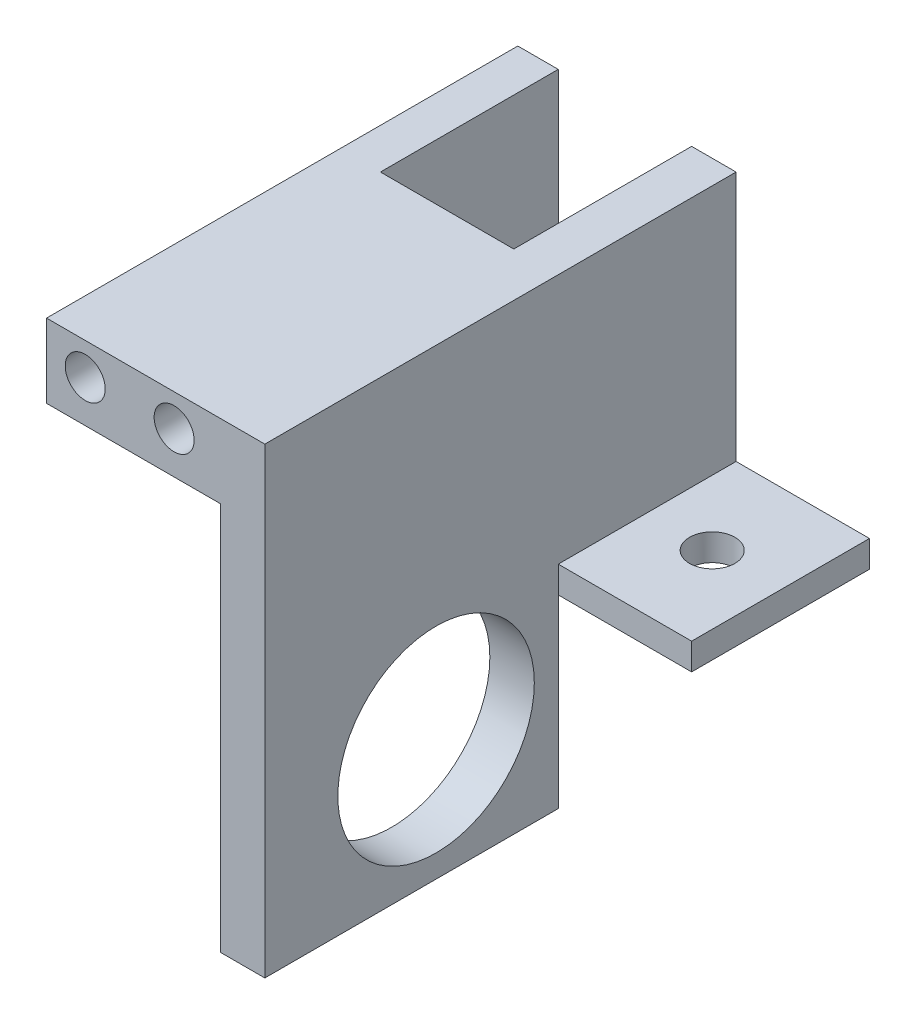
ISO-10303-21;
HEADER;
FILE_DESCRIPTION(('STEP AP214'),'2;1');
FILE_NAME('part.step','',(''),(''),'','','');
FILE_SCHEMA(('AUTOMOTIVE_DESIGN { 1 0 10303 214 1 1 1 1 }'));
ENDSEC;
DATA;
#1=APPLICATION_CONTEXT('core data for automotive mechanical design processes');
#2=APPLICATION_PROTOCOL_DEFINITION('international standard','automotive_design',2000,#1);
#3=PRODUCT_CONTEXT('',#1,'mechanical');
#4=PRODUCT('Part','Part','',(#3));
#5=PRODUCT_RELATED_PRODUCT_CATEGORY('part','',(#4));
#6=PRODUCT_DEFINITION_FORMATION('','',#4);
#7=PRODUCT_DEFINITION_CONTEXT('part definition',#1,'design');
#8=PRODUCT_DEFINITION('design','',#6,#7);
#9=PRODUCT_DEFINITION_SHAPE('','',#8);
#10=(LENGTH_UNIT() NAMED_UNIT(*) SI_UNIT(.MILLI.,.METRE.));
#11=(NAMED_UNIT(*) PLANE_ANGLE_UNIT() SI_UNIT($,.RADIAN.));
#12=(NAMED_UNIT(*) SI_UNIT($,.STERADIAN.) SOLID_ANGLE_UNIT());
#13=UNCERTAINTY_MEASURE_WITH_UNIT(LENGTH_MEASURE(1.E-05),#10,'distance_accuracy_value','');
#14=(GEOMETRIC_REPRESENTATION_CONTEXT(3) GLOBAL_UNCERTAINTY_ASSIGNED_CONTEXT((#13)) GLOBAL_UNIT_ASSIGNED_CONTEXT((#10,
#11,#12)) REPRESENTATION_CONTEXT('',''));
#15=CARTESIAN_POINT('',(0.,0.,0.));
#16=DIRECTION('',(0.,0.,1.));
#17=DIRECTION('',(1.,0.,0.));
#18=AXIS2_PLACEMENT_3D('',#15,#16,#17);
#19=CARTESIAN_POINT('',(0.,-27.8855947664452,0.));
#20=DIRECTION('',(0.,1.,0.));
#21=DIRECTION('',(0.,0.,1.));
#22=AXIS2_PLACEMENT_3D('',#19,#20,#21);
#23=PLANE('',#22);
#24=DIRECTION('',(-1.,0.,0.));
#25=VECTOR('',#24,1.);
#26=CARTESIAN_POINT('',(10.3166666666667,-27.8855947664452,-3.));
#27=LINE('',#26,#25);
#28=CARTESIAN_POINT('',(15.3166666666667,-27.8855947664452,-3.));
#29=VERTEX_POINT('',#28);
#30=CARTESIAN_POINT('',(10.3166666666667,-27.8855947664452,-3.));
#31=VERTEX_POINT('',#30);
#32=EDGE_CURVE('E271',#29,#31,#27,.T.);
#33=ORIENTED_EDGE('',*,*,#32,.T.);
#34=DIRECTION('',(1.,0.,0.));
#35=VECTOR('',#34,1.);
#36=CARTESIAN_POINT('',(-4.68333333333333,-27.8855947664452,-3.));
#37=LINE('',#36,#35);
#38=CARTESIAN_POINT('',(-9.23333333333332,-27.8855947664452,-3.));
#39=VERTEX_POINT('',#38);
#40=EDGE_CURVE('E252',#39,#31,#37,.T.);
#41=ORIENTED_EDGE('',*,*,#40,.F.);
#42=DIRECTION('',(0.,0.,-1.));
#43=VECTOR('',#42,1.);
#44=CARTESIAN_POINT('',(-9.23333333333332,-27.8855947664452,-3.));
#45=LINE('',#44,#43);
#46=CARTESIAN_POINT('',(-9.23333333333332,-27.8855947664452,-23.));
#47=VERTEX_POINT('',#46);
#48=EDGE_CURVE('E191',#39,#47,#45,.T.);
#49=ORIENTED_EDGE('',*,*,#48,.T.);
#50=DIRECTION('',(1.,0.,0.));
#51=VECTOR('',#50,1.);
#52=CARTESIAN_POINT('',(10.3166666666667,-27.8855947664452,-23.));
#53=LINE('',#52,#51);
#54=CARTESIAN_POINT('',(30.3166666666667,-27.8855947664452,-23.));
#55=VERTEX_POINT('',#54);
#56=EDGE_CURVE('E268',#47,#55,#53,.T.);
#57=ORIENTED_EDGE('',*,*,#56,.T.);
#58=DIRECTION('',(0.,0.,-1.));
#59=VECTOR('',#58,1.);
#60=CARTESIAN_POINT('',(30.3166666666667,-27.8855947664452,-3.));
#61=LINE('',#60,#59);
#62=CARTESIAN_POINT('',(30.3166666666667,-27.8855947664452,-3.));
#63=VERTEX_POINT('',#62);
#64=EDGE_CURVE('E224',#63,#55,#61,.T.);
#65=ORIENTED_EDGE('',*,*,#64,.F.);
#66=EDGE_CURVE('E240',#29,#63,#37,.T.);
#67=ORIENTED_EDGE('',*,*,#66,.F.);
#68=EDGE_LOOP('',(#33,#41,#49,#57,#65,#67));
#69=FACE_BOUND('',#68,.T.);
#70=CARTESIAN_POINT('',(22.6325020317526,-27.8855947664452,-13.));
#71=DIRECTION('',(0.,1.,0.));
#72=DIRECTION('',(0.,0.,1.));
#73=AXIS2_PLACEMENT_3D('',#70,#71,#72);
#74=CIRCLE('',#73,2.55);
#75=CARTESIAN_POINT('',(22.6325020317526,-27.8855947664452,-10.45));
#76=VERTEX_POINT('',#75);
#77=EDGE_CURVE('E216',#76,#76,#74,.F.);
#78=ORIENTED_EDGE('',*,*,#77,.F.);
#79=EDGE_LOOP('',(#78));
#80=FACE_BOUND('',#79,.T.);
#81=CARTESIAN_POINT('',(3.00083130158076,-27.8855947664452,-13.));
#82=DIRECTION('',(0.,1.,0.));
#83=DIRECTION('',(0.,0.,1.));
#84=AXIS2_PLACEMENT_3D('',#81,#82,#83);
#85=CIRCLE('',#84,2.55);
#86=CARTESIAN_POINT('',(3.00083130158076,-27.8855947664452,-10.45));
#87=VERTEX_POINT('',#86);
#88=EDGE_CURVE('E208',#87,#87,#85,.T.);
#89=ORIENTED_EDGE('',*,*,#88,.T.);
#90=EDGE_LOOP('',(#89));
#91=FACE_BOUND('',#90,.T.);
#92=ADVANCED_FACE('F45',(#69,#80,#91),#23,.F.);
#93=CARTESIAN_POINT('',(-11.1666666666667,-5.,30.));
#94=DIRECTION('',(0.,1.,0.));
#95=DIRECTION('',(0.,0.,1.));
#96=AXIS2_PLACEMENT_3D('',#93,#94,#95);
#97=PLANE('',#96);
#98=DIRECTION('',(0.,0.,1.));
#99=VECTOR('',#98,1.);
#100=CARTESIAN_POINT('',(-9.23333333333332,-5.,30.));
#101=LINE('',#100,#99);
#102=CARTESIAN_POINT('',(-9.23333333333332,-5.,-3.));
#103=VERTEX_POINT('',#102);
#104=CARTESIAN_POINT('',(-9.23333333333332,-5.,30.));
#105=VERTEX_POINT('',#104);
#106=EDGE_CURVE('E68',#103,#105,#101,.T.);
#107=ORIENTED_EDGE('',*,*,#106,.F.);
#108=DIRECTION('',(-1.,0.,0.));
#109=VECTOR('',#108,1.);
#110=CARTESIAN_POINT('',(10.3166666666667,-5.00000000000002,-3.));
#111=LINE('',#110,#109);
#112=CARTESIAN_POINT('',(-4.68333333333333,-5.00000000000001,-3.));
#113=VERTEX_POINT('',#112);
#114=EDGE_CURVE('E61',#113,#103,#111,.T.);
#115=ORIENTED_EDGE('',*,*,#114,.F.);
#116=CARTESIAN_POINT('',(10.3166666666667,-5.00000000000002,-3.));
#117=VERTEX_POINT('',#116);
#118=EDGE_CURVE('E173',#117,#113,#111,.T.);
#119=ORIENTED_EDGE('',*,*,#118,.F.);
#120=DIRECTION('',(0.,0.,-1.));
#121=VECTOR('',#120,1.);
#122=CARTESIAN_POINT('',(10.3166666666667,-5.,30.));
#123=LINE('',#122,#121);
#124=CARTESIAN_POINT('',(10.3166666666667,-5.,30.));
#125=VERTEX_POINT('',#124);
#126=EDGE_CURVE('E321',#125,#117,#123,.T.);
#127=ORIENTED_EDGE('',*,*,#126,.F.);
#128=DIRECTION('',(1.,0.,0.));
#129=VECTOR('',#128,1.);
#130=CARTESIAN_POINT('',(-11.1666666666667,-5.,30.));
#131=LINE('',#130,#129);
#132=EDGE_CURVE('E297',#105,#125,#131,.T.);
#133=ORIENTED_EDGE('',*,*,#132,.F.);
#134=EDGE_LOOP('',(#107,#115,#119,#127,#133));
#135=FACE_BOUND('',#134,.T.);
#136=ADVANCED_FACE('F47',(#135),#97,.F.);
#137=CARTESIAN_POINT('',(0.,0.,30.));
#138=DIRECTION('',(0.,0.,-1.));
#139=DIRECTION('',(-1.,0.,0.));
#140=AXIS2_PLACEMENT_3D('',#137,#138,#139);
#141=PLANE('',#140);
#142=CARTESIAN_POINT('',(5.11666666666668,-0.299999999999998,30.));
#143=DIRECTION('',(0.,0.,1.));
#144=DIRECTION('',(1.,0.,0.));
#145=AXIS2_PLACEMENT_3D('',#142,#143,#144);
#146=CIRCLE('',#145,2.25);
#147=CARTESIAN_POINT('',(7.36666666666667,-0.299999999999998,30.));
#148=VERTEX_POINT('',#147);
#149=EDGE_CURVE('E349',#148,#148,#146,.T.);
#150=ORIENTED_EDGE('',*,*,#149,.F.);
#151=EDGE_LOOP('',(#150));
#152=FACE_BOUND('',#151,.T.);
#153=CARTESIAN_POINT('',(-4.88333333333333,-0.299999999999998,30.));
#154=DIRECTION('',(0.,0.,1.));
#155=DIRECTION('',(1.,0.,0.));
#156=AXIS2_PLACEMENT_3D('',#153,#154,#155);
#157=CIRCLE('',#156,2.25);
#158=CARTESIAN_POINT('',(-2.63333333333332,-0.299999999999998,30.));
#159=VERTEX_POINT('',#158);
#160=EDGE_CURVE('E345',#159,#159,#157,.T.);
#161=ORIENTED_EDGE('',*,*,#160,.F.);
#162=EDGE_LOOP('',(#161));
#163=FACE_BOUND('',#162,.T.);
#164=DIRECTION('',(0.,-1.,0.));
#165=VECTOR('',#164,1.);
#166=CARTESIAN_POINT('',(-9.23333333333332,-5.01131400333574,30.));
#167=LINE('',#166,#165);
#168=CARTESIAN_POINT('',(-9.23333333333332,3.30440523355484,30.));
#169=VERTEX_POINT('',#168);
#170=EDGE_CURVE('E328',#169,#105,#167,.T.);
#171=ORIENTED_EDGE('',*,*,#170,.T.);
#172=ORIENTED_EDGE('',*,*,#132,.T.);
#173=DIRECTION('',(0.,1.,0.));
#174=VECTOR('',#173,1.);
#175=CARTESIAN_POINT('',(10.3166666666667,-48.6955947664452,30.));
#176=LINE('',#175,#174);
#177=CARTESIAN_POINT('',(10.3166666666667,-48.6955947664452,30.));
#178=VERTEX_POINT('',#177);
#179=EDGE_CURVE('E314',#178,#125,#176,.T.);
#180=ORIENTED_EDGE('',*,*,#179,.F.);
#181=DIRECTION('',(1.,0.,0.));
#182=VECTOR('',#181,1.);
#183=CARTESIAN_POINT('',(10.3166666666667,-48.6955947664452,30.));
#184=LINE('',#183,#182);
#185=CARTESIAN_POINT('',(15.3166666666667,-48.6955947664452,30.));
#186=VERTEX_POINT('',#185);
#187=EDGE_CURVE('E306',#178,#186,#184,.T.);
#188=ORIENTED_EDGE('',*,*,#187,.T.);
#189=DIRECTION('',(0.,1.,0.));
#190=VECTOR('',#189,1.);
#191=CARTESIAN_POINT('',(15.3166666666667,-48.6955947664452,30.));
#192=LINE('',#191,#190);
#193=CARTESIAN_POINT('',(15.3166666666667,3.30440523355484,30.));
#194=VERTEX_POINT('',#193);
#195=EDGE_CURVE('E317',#186,#194,#192,.T.);
#196=ORIENTED_EDGE('',*,*,#195,.T.);
#197=DIRECTION('',(-1.,0.,0.));
#198=VECTOR('',#197,1.);
#199=CARTESIAN_POINT('',(-9.23333333333332,3.30440523355484,30.));
#200=LINE('',#199,#198);
#201=EDGE_CURVE('E331',#194,#169,#200,.T.);
#202=ORIENTED_EDGE('',*,*,#201,.T.);
#203=EDGE_LOOP('',(#171,#172,#180,#188,#196,#202));
#204=FACE_BOUND('',#203,.T.);
#205=ADVANCED_FACE('F360',(#152,#163,#204),#141,.F.);
#206=CARTESIAN_POINT('',(5.11666666666668,-0.299999999999998,15.));
#207=DIRECTION('',(0.,0.,1.));
#208=DIRECTION('',(1.,0.,0.));
#209=AXIS2_PLACEMENT_3D('',#206,#207,#208);
#210=CYLINDRICAL_SURFACE('',#209,2.25);
#211=CARTESIAN_POINT('',(5.11666666666668,-0.299999999999998,15.));
#212=DIRECTION('',(0.,0.,1.));
#213=DIRECTION('',(1.,0.,0.));
#214=AXIS2_PLACEMENT_3D('',#211,#212,#213);
#215=CIRCLE('',#214,2.25);
#216=CARTESIAN_POINT('',(7.36666666666667,-0.299999999999998,15.));
#217=VERTEX_POINT('',#216);
#218=EDGE_CURVE('E340',#217,#217,#215,.T.);
#219=ORIENTED_EDGE('',*,*,#218,.F.);
#220=EDGE_LOOP('',(#219));
#221=FACE_BOUND('',#220,.T.);
#222=ORIENTED_EDGE('',*,*,#149,.T.);
#223=EDGE_LOOP('',(#222));
#224=FACE_BOUND('',#223,.T.);
#225=ADVANCED_FACE('F479',(#221,#224),#210,.F.);
#226=CARTESIAN_POINT('',(5.11666666666668,-0.299999999999998,15.));
#227=DIRECTION('',(0.,0.,1.));
#228=DIRECTION('',(1.,0.,0.));
#229=AXIS2_PLACEMENT_3D('',#226,#227,#228);
#230=PLANE('',#229);
#231=ORIENTED_EDGE('',*,*,#218,.T.);
#232=EDGE_LOOP('',(#231));
#233=FACE_BOUND('',#232,.T.);
#234=ADVANCED_FACE('F477',(#233),#230,.T.);
#235=CARTESIAN_POINT('',(-4.88333333333333,-0.299999999999998,15.));
#236=DIRECTION('',(0.,0.,1.));
#237=DIRECTION('',(1.,0.,0.));
#238=AXIS2_PLACEMENT_3D('',#235,#236,#237);
#239=CYLINDRICAL_SURFACE('',#238,2.25);
#240=CARTESIAN_POINT('',(-4.88333333333333,-0.299999999999998,15.));
#241=DIRECTION('',(0.,0.,1.));
#242=DIRECTION('',(1.,0.,0.));
#243=AXIS2_PLACEMENT_3D('',#240,#241,#242);
#244=CIRCLE('',#243,2.25);
#245=CARTESIAN_POINT('',(-2.63333333333332,-0.299999999999998,15.));
#246=VERTEX_POINT('',#245);
#247=EDGE_CURVE('E341',#246,#246,#244,.T.);
#248=ORIENTED_EDGE('',*,*,#247,.F.);
#249=EDGE_LOOP('',(#248));
#250=FACE_BOUND('',#249,.T.);
#251=ORIENTED_EDGE('',*,*,#160,.T.);
#252=EDGE_LOOP('',(#251));
#253=FACE_BOUND('',#252,.T.);
#254=ADVANCED_FACE('F473',(#250,#253),#239,.F.);
#255=CARTESIAN_POINT('',(0.,0.,15.));
#256=DIRECTION('',(0.,0.,1.));
#257=DIRECTION('',(1.,0.,0.));
#258=AXIS2_PLACEMENT_3D('',#255,#256,#257);
#259=PLANE('',#258);
#260=ORIENTED_EDGE('',*,*,#247,.T.);
#261=EDGE_LOOP('',(#260));
#262=FACE_BOUND('',#261,.T.);
#263=ADVANCED_FACE('F470',(#262),#259,.T.);
#264=CARTESIAN_POINT('',(-9.23333333333332,-5.01131400333574,0.));
#265=DIRECTION('',(-1.,0.,0.));
#266=DIRECTION('',(0.,0.,1.));
#267=AXIS2_PLACEMENT_3D('',#264,#265,#266);
#268=PLANE('',#267);
#269=DIRECTION('',(0.,0.,1.));
#270=VECTOR('',#269,1.);
#271=CARTESIAN_POINT('',(-9.23333333333332,3.30440523355484,0.));
#272=LINE('',#271,#270);
#273=CARTESIAN_POINT('',(-9.23333333333332,3.30440523355484,-23.));
#274=VERTEX_POINT('',#273);
#275=EDGE_CURVE('E335',#274,#169,#272,.T.);
#276=ORIENTED_EDGE('',*,*,#275,.F.);
#277=DIRECTION('',(0.,1.,0.));
#278=VECTOR('',#277,1.);
#279=CARTESIAN_POINT('',(-9.23333333333332,-48.396628382526,-23.));
#280=LINE('',#279,#278);
#281=EDGE_CURVE('E193',#47,#274,#280,.T.);
#282=ORIENTED_EDGE('',*,*,#281,.F.);
#283=ORIENTED_EDGE('',*,*,#48,.F.);
#284=DIRECTION('',(0.,1.,0.));
#285=VECTOR('',#284,1.);
#286=CARTESIAN_POINT('',(-9.23333333333332,-48.396628382526,-3.));
#287=LINE('',#286,#285);
#288=EDGE_CURVE('E185',#39,#103,#287,.T.);
#289=ORIENTED_EDGE('',*,*,#288,.T.);
#290=ORIENTED_EDGE('',*,*,#106,.T.);
#291=ORIENTED_EDGE('',*,*,#170,.F.);
#292=EDGE_LOOP('',(#276,#282,#283,#289,#290,#291));
#293=FACE_BOUND('',#292,.T.);
#294=ADVANCED_FACE('F394',(#293),#268,.T.);
#295=CARTESIAN_POINT('',(-9.23333333333332,3.30440523355484,0.));
#296=DIRECTION('',(0.,1.,0.));
#297=DIRECTION('',(0.,0.,1.));
#298=AXIS2_PLACEMENT_3D('',#295,#296,#297);
#299=PLANE('',#298);
#300=DIRECTION('',(0.,0.,-1.));
#301=VECTOR('',#300,1.);
#302=CARTESIAN_POINT('',(15.3166666666667,3.30440523355484,30.));
#303=LINE('',#302,#301);
#304=CARTESIAN_POINT('',(15.3166666666667,3.30440523355484,-23.));
#305=VERTEX_POINT('',#304);
#306=EDGE_CURVE('E302',#194,#305,#303,.T.);
#307=ORIENTED_EDGE('',*,*,#306,.T.);
#308=DIRECTION('',(1.,0.,0.));
#309=VECTOR('',#308,1.);
#310=CARTESIAN_POINT('',(10.3166666666667,3.30440523355484,-23.));
#311=LINE('',#310,#309);
#312=CARTESIAN_POINT('',(10.3166666666667,3.30440523355484,-23.));
#313=VERTEX_POINT('',#312);
#314=EDGE_CURVE('E291',#313,#305,#311,.T.);
#315=ORIENTED_EDGE('',*,*,#314,.F.);
#316=DIRECTION('',(0.,0.,1.));
#317=VECTOR('',#316,1.);
#318=CARTESIAN_POINT('',(10.3166666666667,3.30440523355484,-23.));
#319=LINE('',#318,#317);
#320=CARTESIAN_POINT('',(10.3166666666667,3.30440523355484,-3.));
#321=VERTEX_POINT('',#320);
#322=EDGE_CURVE('E167',#313,#321,#319,.T.);
#323=ORIENTED_EDGE('',*,*,#322,.T.);
#324=DIRECTION('',(1.,0.,0.));
#325=VECTOR('',#324,1.);
#326=CARTESIAN_POINT('',(-9.23333333333332,3.30440523355486,-3.));
#327=LINE('',#326,#325);
#328=CARTESIAN_POINT('',(-4.68333333333333,3.30440523355484,-3.));
#329=VERTEX_POINT('',#328);
#330=EDGE_CURVE('E158',#329,#321,#327,.T.);
#331=ORIENTED_EDGE('',*,*,#330,.F.);
#332=DIRECTION('',(0.,0.,-1.));
#333=VECTOR('',#332,1.);
#334=CARTESIAN_POINT('',(-4.68333333333333,3.30440523355484,-3.));
#335=LINE('',#334,#333);
#336=CARTESIAN_POINT('',(-4.68333333333333,3.30440523355484,-23.));
#337=VERTEX_POINT('',#336);
#338=EDGE_CURVE('E163',#329,#337,#335,.T.);
#339=ORIENTED_EDGE('',*,*,#338,.T.);
#340=DIRECTION('',(-1.,0.,0.));
#341=VECTOR('',#340,1.);
#342=CARTESIAN_POINT('',(-9.23333333333332,3.30440523355484,-23.));
#343=LINE('',#342,#341);
#344=EDGE_CURVE('E180',#337,#274,#343,.T.);
#345=ORIENTED_EDGE('',*,*,#344,.T.);
#346=ORIENTED_EDGE('',*,*,#275,.T.);
#347=ORIENTED_EDGE('',*,*,#201,.F.);
#348=EDGE_LOOP('',(#307,#315,#323,#331,#339,#345,#346,#347));
#349=FACE_BOUND('',#348,.T.);
#350=ADVANCED_FACE('F160',(#349),#299,.T.);
#351=CARTESIAN_POINT('',(10.3166666666667,-48.6955947664452,30.));
#352=DIRECTION('',(-1.,0.,0.));
#353=DIRECTION('',(0.,0.,1.));
#354=AXIS2_PLACEMENT_3D('',#351,#352,#353);
#355=PLANE('',#354);
#356=CARTESIAN_POINT('',(10.3166666666667,-35.1000000000002,10.7418726174704));
#357=DIRECTION('',(-1.,0.,0.));
#358=DIRECTION('',(0.,0.,1.));
#359=AXIS2_PLACEMENT_3D('',#356,#357,#358);
#360=CIRCLE('',#359,11.05);
#361=CARTESIAN_POINT('',(10.3166666666667,-35.1000000000002,21.7918726174705));
#362=VERTEX_POINT('',#361);
#363=EDGE_CURVE('E181',#362,#362,#360,.T.);
#364=ORIENTED_EDGE('',*,*,#363,.F.);
#365=EDGE_LOOP('',(#364));
#366=FACE_BOUND('',#365,.T.);
#367=DIRECTION('',(0.,1.,0.));
#368=VECTOR('',#367,1.);
#369=CARTESIAN_POINT('',(10.3166666666667,-48.6955947664452,-3.));
#370=LINE('',#369,#368);
#371=CARTESIAN_POINT('',(10.3166666666667,-24.8855947664452,-3.));
#372=VERTEX_POINT('',#371);
#373=EDGE_CURVE('E258',#31,#372,#370,.T.);
#374=ORIENTED_EDGE('',*,*,#373,.F.);
#375=DIRECTION('',(0.,-1.,0.));
#376=VECTOR('',#375,1.);
#377=CARTESIAN_POINT('',(10.3166666666667,-27.8855947664452,-3.));
#378=LINE('',#377,#376);
#379=CARTESIAN_POINT('',(10.3166666666667,-48.6955947664452,-3.));
#380=VERTEX_POINT('',#379);
#381=EDGE_CURVE('E278',#31,#380,#378,.T.);
#382=ORIENTED_EDGE('',*,*,#381,.T.);
#383=DIRECTION('',(0.,0.,1.));
#384=VECTOR('',#383,1.);
#385=CARTESIAN_POINT('',(10.3166666666667,-48.6955947664452,30.));
#386=LINE('',#385,#384);
#387=EDGE_CURVE('E303',#380,#178,#386,.T.);
#388=ORIENTED_EDGE('',*,*,#387,.T.);
#389=ORIENTED_EDGE('',*,*,#179,.T.);
#390=ORIENTED_EDGE('',*,*,#126,.T.);
#391=DIRECTION('',(0.,1.,0.));
#392=VECTOR('',#391,1.);
#393=CARTESIAN_POINT('',(10.3166666666667,-5.00000000000002,-3.));
#394=LINE('',#393,#392);
#395=EDGE_CURVE('E54',#117,#321,#394,.T.);
#396=ORIENTED_EDGE('',*,*,#395,.T.);
#397=ORIENTED_EDGE('',*,*,#322,.F.);
#398=DIRECTION('',(0.,1.,0.));
#399=VECTOR('',#398,1.);
#400=CARTESIAN_POINT('',(10.3166666666667,-48.6955947664452,-23.));
#401=LINE('',#400,#399);
#402=CARTESIAN_POINT('',(10.3166666666667,-24.8855947664452,-23.));
#403=VERTEX_POINT('',#402);
#404=EDGE_CURVE('E288',#403,#313,#401,.T.);
#405=ORIENTED_EDGE('',*,*,#404,.F.);
#406=DIRECTION('',(0.,0.,-1.));
#407=VECTOR('',#406,1.);
#408=CARTESIAN_POINT('',(10.3166666666667,-24.8855947664452,30.));
#409=LINE('',#408,#407);
#410=EDGE_CURVE('E264',#372,#403,#409,.T.);
#411=ORIENTED_EDGE('',*,*,#410,.F.);
#412=EDGE_LOOP('',(#374,#382,#388,#389,#390,#396,#397,#405,#411));
#413=FACE_BOUND('',#412,.T.);
#414=ADVANCED_FACE('F364',(#366,#413),#355,.T.);
#415=CARTESIAN_POINT('',(15.3166666666667,-48.6955947664452,30.));
#416=DIRECTION('',(1.,0.,0.));
#417=DIRECTION('',(0.,0.,-1.));
#418=AXIS2_PLACEMENT_3D('',#415,#416,#417);
#419=PLANE('',#418);
#420=CARTESIAN_POINT('',(15.3166666666667,-35.1000000000002,10.7418726174704));
#421=DIRECTION('',(1.,0.,0.));
#422=DIRECTION('',(0.,0.,-1.));
#423=AXIS2_PLACEMENT_3D('',#420,#421,#422);
#424=CIRCLE('',#423,11.05);
#425=CARTESIAN_POINT('',(15.3166666666667,-35.1000000000002,-0.308127382529553));
#426=VERTEX_POINT('',#425);
#427=EDGE_CURVE('E188',#426,#426,#424,.T.);
#428=ORIENTED_EDGE('',*,*,#427,.F.);
#429=EDGE_LOOP('',(#428));
#430=FACE_BOUND('',#429,.T.);
#431=DIRECTION('',(0.,-1.,0.));
#432=VECTOR('',#431,1.);
#433=CARTESIAN_POINT('',(15.3166666666667,-48.6955947664452,-3.));
#434=LINE('',#433,#432);
#435=CARTESIAN_POINT('',(15.3166666666667,-24.8855947664452,-3.));
#436=VERTEX_POINT('',#435);
#437=EDGE_CURVE('E245',#436,#29,#434,.T.);
#438=ORIENTED_EDGE('',*,*,#437,.F.);
#439=DIRECTION('',(0.,0.,1.));
#440=VECTOR('',#439,1.);
#441=CARTESIAN_POINT('',(15.3166666666667,-24.8855947664452,30.));
#442=LINE('',#441,#440);
#443=CARTESIAN_POINT('',(15.3166666666667,-24.8855947664452,-23.));
#444=VERTEX_POINT('',#443);
#445=EDGE_CURVE('E261',#444,#436,#442,.T.);
#446=ORIENTED_EDGE('',*,*,#445,.F.);
#447=DIRECTION('',(0.,-1.,0.));
#448=VECTOR('',#447,1.);
#449=CARTESIAN_POINT('',(15.3166666666667,3.30440523355484,-23.));
#450=LINE('',#449,#448);
#451=EDGE_CURVE('E282',#305,#444,#450,.T.);
#452=ORIENTED_EDGE('',*,*,#451,.F.);
#453=ORIENTED_EDGE('',*,*,#306,.F.);
#454=ORIENTED_EDGE('',*,*,#195,.F.);
#455=DIRECTION('',(0.,0.,-1.));
#456=VECTOR('',#455,1.);
#457=CARTESIAN_POINT('',(15.3166666666667,-48.6955947664452,30.));
#458=LINE('',#457,#456);
#459=CARTESIAN_POINT('',(15.3166666666667,-48.6955947664452,-3.));
#460=VERTEX_POINT('',#459);
#461=EDGE_CURVE('E310',#186,#460,#458,.T.);
#462=ORIENTED_EDGE('',*,*,#461,.T.);
#463=DIRECTION('',(0.,-1.,0.));
#464=VECTOR('',#463,1.);
#465=CARTESIAN_POINT('',(15.3166666666667,-27.8855947664452,-3.));
#466=LINE('',#465,#464);
#467=EDGE_CURVE('E275',#29,#460,#466,.T.);
#468=ORIENTED_EDGE('',*,*,#467,.F.);
#469=EDGE_LOOP('',(#438,#446,#452,#453,#454,#462,#468));
#470=FACE_BOUND('',#469,.T.);
#471=ADVANCED_FACE('F375',(#430,#470),#419,.T.);
#472=CARTESIAN_POINT('',(0.,-48.6955947664452,0.));
#473=DIRECTION('',(0.,-1.,0.));
#474=DIRECTION('',(0.,0.,-1.));
#475=AXIS2_PLACEMENT_3D('',#472,#473,#474);
#476=PLANE('',#475);
#477=DIRECTION('',(-1.,0.,0.));
#478=VECTOR('',#477,1.);
#479=CARTESIAN_POINT('',(10.3166666666667,-48.6955947664452,-3.));
#480=LINE('',#479,#478);
#481=EDGE_CURVE('E267',#460,#380,#480,.T.);
#482=ORIENTED_EDGE('',*,*,#481,.F.);
#483=ORIENTED_EDGE('',*,*,#461,.F.);
#484=ORIENTED_EDGE('',*,*,#187,.F.);
#485=ORIENTED_EDGE('',*,*,#387,.F.);
#486=EDGE_LOOP('',(#482,#483,#484,#485));
#487=FACE_BOUND('',#486,.T.);
#488=ADVANCED_FACE('F369',(#487),#476,.T.);
#489=CARTESIAN_POINT('',(0.,0.,-3.));
#490=DIRECTION('',(0.,0.,-1.));
#491=DIRECTION('',(-1.,0.,0.));
#492=AXIS2_PLACEMENT_3D('',#489,#490,#491);
#493=PLANE('',#492);
#494=DIRECTION('',(0.,-1.,0.));
#495=VECTOR('',#494,1.);
#496=CARTESIAN_POINT('',(-4.68333333333333,0.,-3.));
#497=LINE('',#496,#495);
#498=EDGE_CURVE('E12',#329,#113,#497,.T.);
#499=ORIENTED_EDGE('',*,*,#498,.F.);
#500=ORIENTED_EDGE('',*,*,#330,.T.);
#501=ORIENTED_EDGE('',*,*,#395,.F.);
#502=ORIENTED_EDGE('',*,*,#118,.T.);
#503=EDGE_LOOP('',(#499,#500,#501,#502));
#504=FACE_BOUND('',#503,.T.);
#505=ADVANCED_FACE('F172',(#504),#493,.T.);
#506=CARTESIAN_POINT('',(0.,0.,-23.));
#507=DIRECTION('',(0.,0.,-1.));
#508=DIRECTION('',(-1.,0.,0.));
#509=AXIS2_PLACEMENT_3D('',#506,#507,#508);
#510=PLANE('',#509);
#511=ORIENTED_EDGE('',*,*,#451,.T.);
#512=DIRECTION('',(1.,0.,0.));
#513=VECTOR('',#512,1.);
#514=CARTESIAN_POINT('',(-4.68333333333333,-24.8855947664452,-23.));
#515=LINE('',#514,#513);
#516=CARTESIAN_POINT('',(30.3166666666667,-24.8855947664452,-23.));
#517=VERTEX_POINT('',#516);
#518=EDGE_CURVE('E251',#444,#517,#515,.T.);
#519=ORIENTED_EDGE('',*,*,#518,.T.);
#520=DIRECTION('',(0.,1.,0.));
#521=VECTOR('',#520,1.);
#522=CARTESIAN_POINT('',(30.3166666666667,-27.8855947664452,-23.));
#523=LINE('',#522,#521);
#524=EDGE_CURVE('E228',#55,#517,#523,.T.);
#525=ORIENTED_EDGE('',*,*,#524,.F.);
#526=ORIENTED_EDGE('',*,*,#56,.F.);
#527=ORIENTED_EDGE('',*,*,#281,.T.);
#528=ORIENTED_EDGE('',*,*,#344,.F.);
#529=DIRECTION('',(0.,1.,0.));
#530=VECTOR('',#529,1.);
#531=CARTESIAN_POINT('',(-4.68333333333333,-48.396628382526,-23.));
#532=LINE('',#531,#530);
#533=CARTESIAN_POINT('',(-4.68333333333333,-24.8855947664452,-23.));
#534=VERTEX_POINT('',#533);
#535=EDGE_CURVE('E178',#534,#337,#532,.T.);
#536=ORIENTED_EDGE('',*,*,#535,.F.);
#537=EDGE_CURVE('E247',#534,#403,#515,.T.);
#538=ORIENTED_EDGE('',*,*,#537,.T.);
#539=ORIENTED_EDGE('',*,*,#404,.T.);
#540=ORIENTED_EDGE('',*,*,#314,.T.);
#541=EDGE_LOOP('',(#511,#519,#525,#526,#527,#528,#536,#538,#539,#540));
#542=FACE_BOUND('',#541,.T.);
#543=ADVANCED_FACE('F378',(#542),#510,.T.);
#544=CARTESIAN_POINT('',(10.3166666666667,-27.8855947664452,-3.));
#545=DIRECTION('',(0.,0.,1.));
#546=DIRECTION('',(1.,0.,0.));
#547=AXIS2_PLACEMENT_3D('',#544,#545,#546);
#548=PLANE('',#547);
#549=ORIENTED_EDGE('',*,*,#481,.T.);
#550=ORIENTED_EDGE('',*,*,#381,.F.);
#551=ORIENTED_EDGE('',*,*,#32,.F.);
#552=ORIENTED_EDGE('',*,*,#467,.T.);
#553=EDGE_LOOP('',(#549,#550,#551,#552));
#554=FACE_BOUND('',#553,.T.);
#555=ADVANCED_FACE('F413',(#554),#548,.F.);
#556=CARTESIAN_POINT('',(30.3166666666667,0.,0.));
#557=DIRECTION('',(-1.,0.,0.));
#558=DIRECTION('',(0.,0.,1.));
#559=AXIS2_PLACEMENT_3D('',#556,#557,#558);
#560=PLANE('',#559);
#561=DIRECTION('',(0.,-1.,0.));
#562=VECTOR('',#561,1.);
#563=CARTESIAN_POINT('',(30.3166666666667,-27.8855947664452,-3.));
#564=LINE('',#563,#562);
#565=CARTESIAN_POINT('',(30.3166666666667,-24.8855947664452,-3.));
#566=VERTEX_POINT('',#565);
#567=EDGE_CURVE('E220',#566,#63,#564,.T.);
#568=ORIENTED_EDGE('',*,*,#567,.T.);
#569=ORIENTED_EDGE('',*,*,#64,.T.);
#570=ORIENTED_EDGE('',*,*,#524,.T.);
#571=DIRECTION('',(0.,0.,1.));
#572=VECTOR('',#571,1.);
#573=CARTESIAN_POINT('',(30.3166666666667,-24.8855947664452,-3.));
#574=LINE('',#573,#572);
#575=EDGE_CURVE('E232',#517,#566,#574,.T.);
#576=ORIENTED_EDGE('',*,*,#575,.T.);
#577=EDGE_LOOP('',(#568,#569,#570,#576));
#578=FACE_BOUND('',#577,.T.);
#579=ADVANCED_FACE('F407',(#578),#560,.F.);
#580=CARTESIAN_POINT('',(-4.68333333333333,-24.8855947664452,-3.));
#581=DIRECTION('',(0.,1.,0.));
#582=DIRECTION('',(0.,0.,1.));
#583=AXIS2_PLACEMENT_3D('',#580,#581,#582);
#584=PLANE('',#583);
#585=CARTESIAN_POINT('',(22.6325020317526,-24.8855947664452,-13.));
#586=DIRECTION('',(0.,-1.,0.));
#587=DIRECTION('',(0.,0.,-1.));
#588=AXIS2_PLACEMENT_3D('',#585,#586,#587);
#589=CIRCLE('',#588,2.55);
#590=CARTESIAN_POINT('',(22.6325020317526,-24.8855947664452,-15.55));
#591=VERTEX_POINT('',#590);
#592=EDGE_CURVE('E209',#591,#591,#589,.T.);
#593=ORIENTED_EDGE('',*,*,#592,.T.);
#594=EDGE_LOOP('',(#593));
#595=FACE_BOUND('',#594,.T.);
#596=ORIENTED_EDGE('',*,*,#518,.F.);
#597=ORIENTED_EDGE('',*,*,#445,.T.);
#598=DIRECTION('',(1.,0.,0.));
#599=VECTOR('',#598,1.);
#600=CARTESIAN_POINT('',(-4.68333333333333,-24.8855947664452,-3.));
#601=LINE('',#600,#599);
#602=EDGE_CURVE('E246',#436,#566,#601,.T.);
#603=ORIENTED_EDGE('',*,*,#602,.T.);
#604=ORIENTED_EDGE('',*,*,#575,.F.);
#605=EDGE_LOOP('',(#596,#597,#603,#604));
#606=FACE_BOUND('',#605,.T.);
#607=ADVANCED_FACE('F403',(#595,#606),#584,.T.);
#608=CARTESIAN_POINT('',(-4.68333333333333,-27.8855947664452,-3.));
#609=DIRECTION('',(0.,0.,1.));
#610=DIRECTION('',(1.,0.,0.));
#611=AXIS2_PLACEMENT_3D('',#608,#609,#610);
#612=PLANE('',#611);
#613=ORIENTED_EDGE('',*,*,#602,.F.);
#614=ORIENTED_EDGE('',*,*,#437,.T.);
#615=ORIENTED_EDGE('',*,*,#66,.T.);
#616=ORIENTED_EDGE('',*,*,#567,.F.);
#617=EDGE_LOOP('',(#613,#614,#615,#616));
#618=FACE_BOUND('',#617,.T.);
#619=ADVANCED_FACE('F409',(#618),#612,.T.);
#620=CARTESIAN_POINT('',(3.00083130158076,-24.8855947664452,-13.));
#621=DIRECTION('',(0.,1.,0.));
#622=DIRECTION('',(0.,0.,1.));
#623=AXIS2_PLACEMENT_3D('',#620,#621,#622);
#624=CIRCLE('',#623,2.55);
#625=CARTESIAN_POINT('',(3.00083130158076,-24.8855947664452,-10.45));
#626=VERTEX_POINT('',#625);
#627=EDGE_CURVE('E204',#626,#626,#624,.T.);
#628=ORIENTED_EDGE('',*,*,#627,.F.);
#629=EDGE_LOOP('',(#628));
#630=FACE_BOUND('',#629,.T.);
#631=CARTESIAN_POINT('',(-4.68333333333333,-24.8855947664452,-3.));
#632=VERTEX_POINT('',#631);
#633=EDGE_CURVE('E241',#632,#372,#601,.T.);
#634=ORIENTED_EDGE('',*,*,#633,.T.);
#635=ORIENTED_EDGE('',*,*,#410,.T.);
#636=ORIENTED_EDGE('',*,*,#537,.F.);
#637=DIRECTION('',(0.,0.,1.));
#638=VECTOR('',#637,1.);
#639=CARTESIAN_POINT('',(-4.68333333333333,-24.8855947664452,-3.));
#640=LINE('',#639,#638);
#641=EDGE_CURVE('E236',#534,#632,#640,.T.);
#642=ORIENTED_EDGE('',*,*,#641,.T.);
#643=EDGE_LOOP('',(#634,#635,#636,#642));
#644=FACE_BOUND('',#643,.T.);
#645=ADVANCED_FACE('F383',(#630,#644),#584,.T.);
#646=ORIENTED_EDGE('',*,*,#40,.T.);
#647=ORIENTED_EDGE('',*,*,#373,.T.);
#648=ORIENTED_EDGE('',*,*,#633,.F.);
#649=DIRECTION('',(0.,1.,0.));
#650=VECTOR('',#649,1.);
#651=CARTESIAN_POINT('',(-4.68333333333333,-48.396628382526,-3.));
#652=LINE('',#651,#650);
#653=EDGE_CURVE('E199',#632,#113,#652,.T.);
#654=ORIENTED_EDGE('',*,*,#653,.T.);
#655=ORIENTED_EDGE('',*,*,#114,.T.);
#656=ORIENTED_EDGE('',*,*,#288,.F.);
#657=EDGE_LOOP('',(#646,#647,#648,#654,#655,#656));
#658=FACE_BOUND('',#657,.T.);
#659=ADVANCED_FACE('F386',(#658),#612,.T.);
#660=CARTESIAN_POINT('',(3.00083130158076,-48.6955947664452,-13.));
#661=DIRECTION('',(0.,1.,0.));
#662=DIRECTION('',(0.,0.,1.));
#663=AXIS2_PLACEMENT_3D('',#660,#661,#662);
#664=CYLINDRICAL_SURFACE('',#663,2.55);
#665=ORIENTED_EDGE('',*,*,#627,.T.);
#666=EDGE_LOOP('',(#665));
#667=FACE_BOUND('',#666,.T.);
#668=ORIENTED_EDGE('',*,*,#88,.F.);
#669=EDGE_LOOP('',(#668));
#670=FACE_BOUND('',#669,.T.);
#671=ADVANCED_FACE('F436',(#667,#670),#664,.F.);
#672=CARTESIAN_POINT('',(22.6325020317526,-48.6955947664452,-13.));
#673=DIRECTION('',(0.,1.,0.));
#674=DIRECTION('',(0.,0.,1.));
#675=AXIS2_PLACEMENT_3D('',#672,#673,#674);
#676=CYLINDRICAL_SURFACE('',#675,2.55);
#677=ORIENTED_EDGE('',*,*,#592,.F.);
#678=EDGE_LOOP('',(#677));
#679=FACE_BOUND('',#678,.T.);
#680=ORIENTED_EDGE('',*,*,#77,.T.);
#681=EDGE_LOOP('',(#680));
#682=FACE_BOUND('',#681,.T.);
#683=ADVANCED_FACE('F433',(#679,#682),#676,.F.);
#684=CARTESIAN_POINT('',(-4.68333333333333,-48.396628382526,-3.));
#685=DIRECTION('',(1.,0.,0.));
#686=DIRECTION('',(0.,0.,-1.));
#687=AXIS2_PLACEMENT_3D('',#684,#685,#686);
#688=PLANE('',#687);
#689=ORIENTED_EDGE('',*,*,#641,.F.);
#690=ORIENTED_EDGE('',*,*,#535,.T.);
#691=ORIENTED_EDGE('',*,*,#338,.F.);
#692=ORIENTED_EDGE('',*,*,#498,.T.);
#693=ORIENTED_EDGE('',*,*,#653,.F.);
#694=EDGE_LOOP('',(#689,#690,#691,#692,#693));
#695=FACE_BOUND('',#694,.T.);
#696=ADVANCED_FACE('F176',(#695),#688,.T.);
#697=CARTESIAN_POINT('',(5.31666666666667,-35.1000000000002,10.7418726174704));
#698=DIRECTION('',(1.,0.,0.));
#699=DIRECTION('',(0.,0.,-1.));
#700=AXIS2_PLACEMENT_3D('',#697,#698,#699);
#701=CYLINDRICAL_SURFACE('',#700,11.05);
#702=ORIENTED_EDGE('',*,*,#363,.T.);
#703=EDGE_LOOP('',(#702));
#704=FACE_BOUND('',#703,.T.);
#705=ORIENTED_EDGE('',*,*,#427,.T.);
#706=EDGE_LOOP('',(#705));
#707=FACE_BOUND('',#706,.T.);
#708=ADVANCED_FACE('F443',(#704,#707),#701,.F.);
#709=CLOSED_SHELL('',(#92,#136,#205,#225,#234,#254,#263,#294,#350,#414,#471,#488,#505,#543,#555,
#579,#607,#619,#645,#659,#671,#683,#696,#708));
#710=MANIFOLD_SOLID_BREP('B2',#709);
#711=ADVANCED_BREP_SHAPE_REPRESENTATION('',(#18,#710),#14);
#712=SHAPE_DEFINITION_REPRESENTATION(#9,#711);
ENDSEC;
END-ISO-10303-21;
